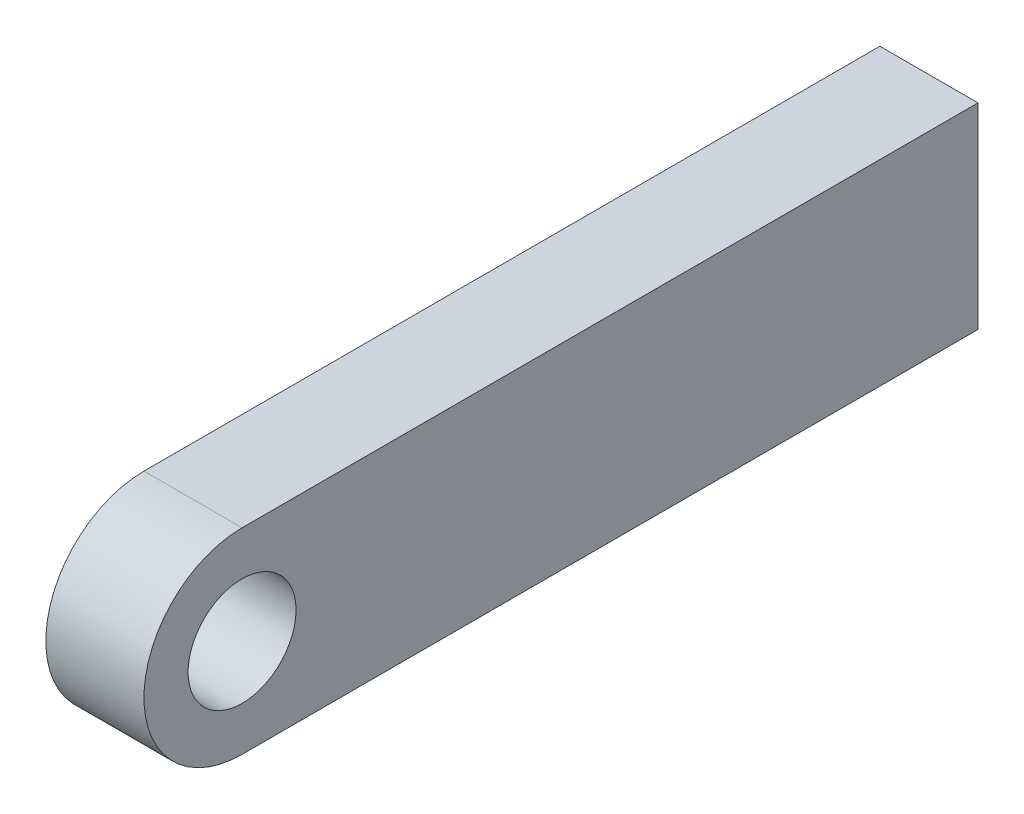
ISO-10303-21;
HEADER;
FILE_DESCRIPTION(('STEP AP214'),'2;1');
FILE_NAME('part.step','',(''),(''),'','','');
FILE_SCHEMA(('AUTOMOTIVE_DESIGN { 1 0 10303 214 1 1 1 1 }'));
ENDSEC;
DATA;
#1=APPLICATION_CONTEXT('core data for automotive mechanical design processes');
#2=APPLICATION_PROTOCOL_DEFINITION('international standard','automotive_design',2000,#1);
#3=PRODUCT_CONTEXT('',#1,'mechanical');
#4=PRODUCT('Part','Part','',(#3));
#5=PRODUCT_RELATED_PRODUCT_CATEGORY('part','',(#4));
#6=PRODUCT_DEFINITION_FORMATION('','',#4);
#7=PRODUCT_DEFINITION_CONTEXT('part definition',#1,'design');
#8=PRODUCT_DEFINITION('design','',#6,#7);
#9=PRODUCT_DEFINITION_SHAPE('','',#8);
#10=(LENGTH_UNIT() NAMED_UNIT(*) SI_UNIT(.MILLI.,.METRE.));
#11=(NAMED_UNIT(*) PLANE_ANGLE_UNIT() SI_UNIT($,.RADIAN.));
#12=(NAMED_UNIT(*) SI_UNIT($,.STERADIAN.) SOLID_ANGLE_UNIT());
#13=UNCERTAINTY_MEASURE_WITH_UNIT(LENGTH_MEASURE(1.E-05),#10,'distance_accuracy_value','');
#14=(GEOMETRIC_REPRESENTATION_CONTEXT(3) GLOBAL_UNCERTAINTY_ASSIGNED_CONTEXT((#13)) GLOBAL_UNIT_ASSIGNED_CONTEXT((#10,
#11,#12)) REPRESENTATION_CONTEXT('',''));
#15=CARTESIAN_POINT('',(0.,0.,0.));
#16=DIRECTION('',(0.,0.,1.));
#17=DIRECTION('',(1.,0.,0.));
#18=AXIS2_PLACEMENT_3D('',#15,#16,#17);
#19=CARTESIAN_POINT('',(20.,20.,150.));
#20=DIRECTION('',(-1.,0.,0.));
#21=DIRECTION('',(0.,0.,1.));
#22=AXIS2_PLACEMENT_3D('',#19,#20,#21);
#23=CYLINDRICAL_SURFACE('',#22,20.);
#24=CARTESIAN_POINT('',(0.,20.,150.));
#25=DIRECTION('',(1.,0.,0.));
#26=DIRECTION('',(0.,0.,-1.));
#27=AXIS2_PLACEMENT_3D('',#24,#25,#26);
#28=CIRCLE('',#27,20.);
#29=CARTESIAN_POINT('',(0.,40.,150.));
#30=VERTEX_POINT('',#29);
#31=CARTESIAN_POINT('',(0.,0.,150.));
#32=VERTEX_POINT('',#31);
#33=EDGE_CURVE('E102',#30,#32,#28,.T.);
#34=ORIENTED_EDGE('',*,*,#33,.T.);
#35=DIRECTION('',(-1.,0.,0.));
#36=VECTOR('',#35,1.);
#37=CARTESIAN_POINT('',(20.,0.,150.));
#38=LINE('',#37,#36);
#39=CARTESIAN_POINT('',(20.,0.,150.));
#40=VERTEX_POINT('',#39);
#41=EDGE_CURVE('E11',#40,#32,#38,.T.);
#42=ORIENTED_EDGE('',*,*,#41,.F.);
#43=CARTESIAN_POINT('',(20.,20.,150.));
#44=DIRECTION('',(1.,0.,0.));
#45=DIRECTION('',(0.,0.,-1.));
#46=AXIS2_PLACEMENT_3D('',#43,#44,#45);
#47=CIRCLE('',#46,20.);
#48=CARTESIAN_POINT('',(20.,40.,150.));
#49=VERTEX_POINT('',#48);
#50=EDGE_CURVE('E76',#49,#40,#47,.T.);
#51=ORIENTED_EDGE('',*,*,#50,.F.);
#52=DIRECTION('',(-1.,0.,0.));
#53=VECTOR('',#52,1.);
#54=CARTESIAN_POINT('',(20.,40.,150.));
#55=LINE('',#54,#53);
#56=EDGE_CURVE('E52',#49,#30,#55,.T.);
#57=ORIENTED_EDGE('',*,*,#56,.T.);
#58=EDGE_LOOP('',(#34,#42,#51,#57));
#59=FACE_BOUND('',#58,.T.);
#60=ADVANCED_FACE('F35',(#59),#23,.T.);
#61=CARTESIAN_POINT('',(20.,0.,0.));
#62=DIRECTION('',(0.,-1.,0.));
#63=DIRECTION('',(0.,0.,-1.));
#64=AXIS2_PLACEMENT_3D('',#61,#62,#63);
#65=PLANE('',#64);
#66=DIRECTION('',(0.,0.,1.));
#67=VECTOR('',#66,1.);
#68=CARTESIAN_POINT('',(0.,0.,0.));
#69=LINE('',#68,#67);
#70=CARTESIAN_POINT('',(0.,0.,0.));
#71=VERTEX_POINT('',#70);
#72=EDGE_CURVE('E85',#71,#32,#69,.T.);
#73=ORIENTED_EDGE('',*,*,#72,.F.);
#74=DIRECTION('',(-1.,0.,0.));
#75=VECTOR('',#74,1.);
#76=CARTESIAN_POINT('',(20.,0.,0.));
#77=LINE('',#76,#75);
#78=CARTESIAN_POINT('',(20.,0.,0.));
#79=VERTEX_POINT('',#78);
#80=EDGE_CURVE('E44',#79,#71,#77,.T.);
#81=ORIENTED_EDGE('',*,*,#80,.F.);
#82=DIRECTION('',(0.,0.,1.));
#83=VECTOR('',#82,1.);
#84=CARTESIAN_POINT('',(20.,0.,0.));
#85=LINE('',#84,#83);
#86=EDGE_CURVE('E83',#79,#40,#85,.T.);
#87=ORIENTED_EDGE('',*,*,#86,.T.);
#88=ORIENTED_EDGE('',*,*,#41,.T.);
#89=EDGE_LOOP('',(#73,#81,#87,#88));
#90=FACE_BOUND('',#89,.T.);
#91=ADVANCED_FACE('F82',(#90),#65,.T.);
#92=CARTESIAN_POINT('',(20.,0.,0.));
#93=DIRECTION('',(0.,0.,-1.));
#94=DIRECTION('',(-1.,0.,0.));
#95=AXIS2_PLACEMENT_3D('',#92,#93,#94);
#96=PLANE('',#95);
#97=DIRECTION('',(0.,-1.,0.));
#98=VECTOR('',#97,1.);
#99=CARTESIAN_POINT('',(0.,0.,0.));
#100=LINE('',#99,#98);
#101=CARTESIAN_POINT('',(0.,40.,0.));
#102=VERTEX_POINT('',#101);
#103=EDGE_CURVE('E105',#102,#71,#100,.T.);
#104=ORIENTED_EDGE('',*,*,#103,.F.);
#105=DIRECTION('',(-1.,0.,0.));
#106=VECTOR('',#105,1.);
#107=CARTESIAN_POINT('',(20.,40.,0.));
#108=LINE('',#107,#106);
#109=CARTESIAN_POINT('',(20.,40.,0.));
#110=VERTEX_POINT('',#109);
#111=EDGE_CURVE('E65',#110,#102,#108,.T.);
#112=ORIENTED_EDGE('',*,*,#111,.F.);
#113=DIRECTION('',(0.,-1.,0.));
#114=VECTOR('',#113,1.);
#115=CARTESIAN_POINT('',(20.,0.,0.));
#116=LINE('',#115,#114);
#117=EDGE_CURVE('E91',#110,#79,#116,.T.);
#118=ORIENTED_EDGE('',*,*,#117,.T.);
#119=ORIENTED_EDGE('',*,*,#80,.T.);
#120=EDGE_LOOP('',(#104,#112,#118,#119));
#121=FACE_BOUND('',#120,.T.);
#122=ADVANCED_FACE('F93',(#121),#96,.T.);
#123=CARTESIAN_POINT('',(20.,20.,150.));
#124=DIRECTION('',(-1.,0.,0.));
#125=DIRECTION('',(0.,0.,1.));
#126=AXIS2_PLACEMENT_3D('',#123,#124,#125);
#127=CYLINDRICAL_SURFACE('',#126,11.);
#128=CARTESIAN_POINT('',(20.,20.,150.));
#129=DIRECTION('',(1.,0.,0.));
#130=DIRECTION('',(0.,0.,-1.));
#131=AXIS2_PLACEMENT_3D('',#128,#129,#130);
#132=CIRCLE('',#131,11.);
#133=CARTESIAN_POINT('',(20.,20.,139.));
#134=VERTEX_POINT('',#133);
#135=EDGE_CURVE('E110',#134,#134,#132,.T.);
#136=ORIENTED_EDGE('',*,*,#135,.T.);
#137=EDGE_LOOP('',(#136));
#138=FACE_BOUND('',#137,.T.);
#139=CARTESIAN_POINT('',(0.,20.,150.));
#140=DIRECTION('',(1.,0.,0.));
#141=DIRECTION('',(0.,0.,-1.));
#142=AXIS2_PLACEMENT_3D('',#139,#140,#141);
#143=CIRCLE('',#142,11.);
#144=CARTESIAN_POINT('',(0.,20.,139.));
#145=VERTEX_POINT('',#144);
#146=EDGE_CURVE('E99',#145,#145,#143,.T.);
#147=ORIENTED_EDGE('',*,*,#146,.F.);
#148=EDGE_LOOP('',(#147));
#149=FACE_BOUND('',#148,.T.);
#150=ADVANCED_FACE('F37',(#138,#149),#127,.F.);
#151=CARTESIAN_POINT('',(20.,40.,0.));
#152=DIRECTION('',(0.,1.,0.));
#153=DIRECTION('',(0.,0.,1.));
#154=AXIS2_PLACEMENT_3D('',#151,#152,#153);
#155=PLANE('',#154);
#156=DIRECTION('',(0.,0.,-1.));
#157=VECTOR('',#156,1.);
#158=CARTESIAN_POINT('',(0.,40.,0.));
#159=LINE('',#158,#157);
#160=EDGE_CURVE('E107',#30,#102,#159,.T.);
#161=ORIENTED_EDGE('',*,*,#160,.F.);
#162=ORIENTED_EDGE('',*,*,#56,.F.);
#163=DIRECTION('',(0.,0.,-1.));
#164=VECTOR('',#163,1.);
#165=CARTESIAN_POINT('',(20.,40.,0.));
#166=LINE('',#165,#164);
#167=EDGE_CURVE('E94',#49,#110,#166,.T.);
#168=ORIENTED_EDGE('',*,*,#167,.T.);
#169=ORIENTED_EDGE('',*,*,#111,.T.);
#170=EDGE_LOOP('',(#161,#162,#168,#169));
#171=FACE_BOUND('',#170,.T.);
#172=ADVANCED_FACE('F121',(#171),#155,.T.);
#173=CARTESIAN_POINT('',(20.,0.,0.));
#174=DIRECTION('',(1.,0.,0.));
#175=DIRECTION('',(0.,0.,-1.));
#176=AXIS2_PLACEMENT_3D('',#173,#174,#175);
#177=PLANE('',#176);
#178=ORIENTED_EDGE('',*,*,#135,.F.);
#179=EDGE_LOOP('',(#178));
#180=FACE_BOUND('',#179,.T.);
#181=ORIENTED_EDGE('',*,*,#50,.T.);
#182=ORIENTED_EDGE('',*,*,#86,.F.);
#183=ORIENTED_EDGE('',*,*,#117,.F.);
#184=ORIENTED_EDGE('',*,*,#167,.F.);
#185=EDGE_LOOP('',(#181,#182,#183,#184));
#186=FACE_BOUND('',#185,.T.);
#187=ADVANCED_FACE('F90',(#180,#186),#177,.T.);
#188=CARTESIAN_POINT('',(0.,0.,0.));
#189=DIRECTION('',(1.,0.,0.));
#190=DIRECTION('',(0.,0.,-1.));
#191=AXIS2_PLACEMENT_3D('',#188,#189,#190);
#192=PLANE('',#191);
#193=ORIENTED_EDGE('',*,*,#146,.T.);
#194=EDGE_LOOP('',(#193));
#195=FACE_BOUND('',#194,.T.);
#196=ORIENTED_EDGE('',*,*,#33,.F.);
#197=ORIENTED_EDGE('',*,*,#160,.T.);
#198=ORIENTED_EDGE('',*,*,#103,.T.);
#199=ORIENTED_EDGE('',*,*,#72,.T.);
#200=EDGE_LOOP('',(#196,#197,#198,#199));
#201=FACE_BOUND('',#200,.T.);
#202=ADVANCED_FACE('F120',(#195,#201),#192,.F.);
#203=CLOSED_SHELL('',(#60,#91,#122,#150,#172,#187,#202));
#204=MANIFOLD_SOLID_BREP('B2',#203);
#205=ADVANCED_BREP_SHAPE_REPRESENTATION('',(#18,#204),#14);
#206=SHAPE_DEFINITION_REPRESENTATION(#9,#205);
ENDSEC;
END-ISO-10303-21;
